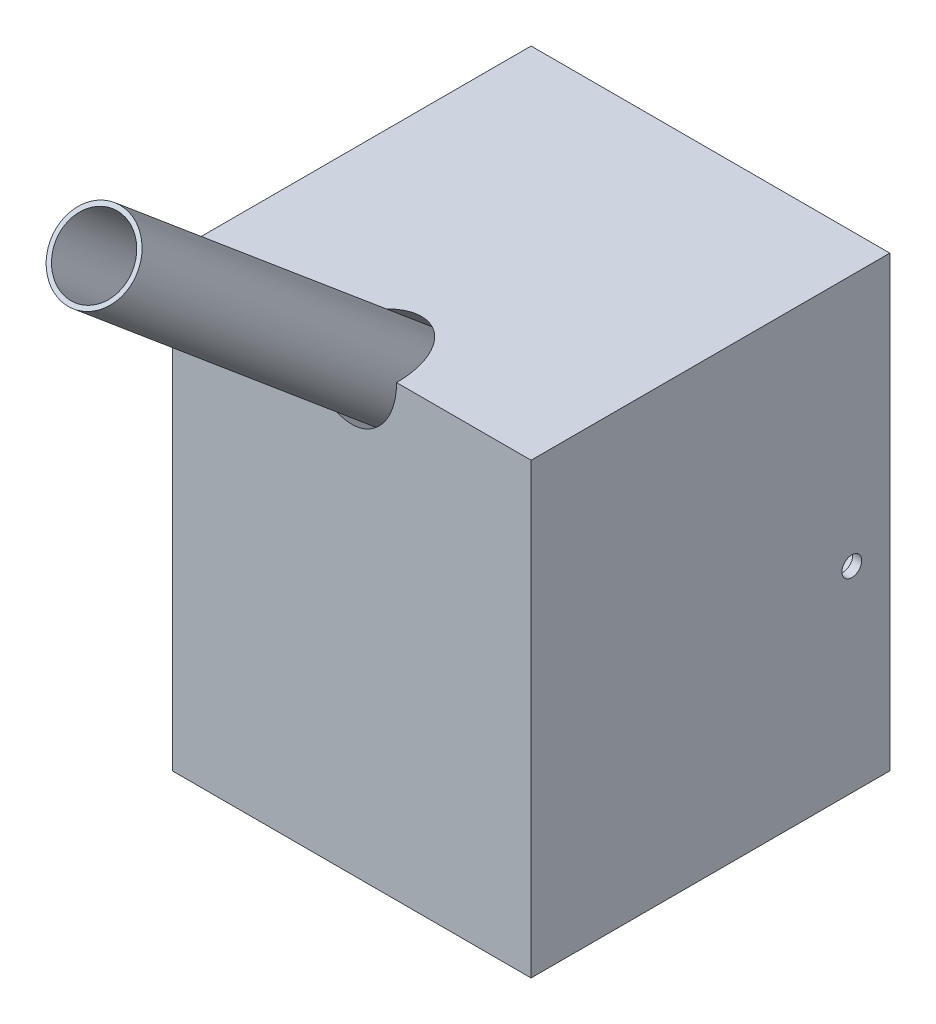
ISO-10303-21;
HEADER;
FILE_DESCRIPTION(('STEP AP214'),'2;1');
FILE_NAME('part.step','',(''),(''),'','','');
FILE_SCHEMA(('AUTOMOTIVE_DESIGN { 1 0 10303 214 1 1 1 1 }'));
ENDSEC;
DATA;
#1=APPLICATION_CONTEXT('core data for automotive mechanical design processes');
#2=APPLICATION_PROTOCOL_DEFINITION('international standard','automotive_design',2000,#1);
#3=PRODUCT_CONTEXT('',#1,'mechanical');
#4=PRODUCT('Part','Part','',(#3));
#5=PRODUCT_RELATED_PRODUCT_CATEGORY('part','',(#4));
#6=PRODUCT_DEFINITION_FORMATION('','',#4);
#7=PRODUCT_DEFINITION_CONTEXT('part definition',#1,'design');
#8=PRODUCT_DEFINITION('design','',#6,#7);
#9=PRODUCT_DEFINITION_SHAPE('','',#8);
#10=(LENGTH_UNIT() NAMED_UNIT(*) SI_UNIT(.MILLI.,.METRE.));
#11=(NAMED_UNIT(*) PLANE_ANGLE_UNIT() SI_UNIT($,.RADIAN.));
#12=(NAMED_UNIT(*) SI_UNIT($,.STERADIAN.) SOLID_ANGLE_UNIT());
#13=UNCERTAINTY_MEASURE_WITH_UNIT(LENGTH_MEASURE(1.E-05),#10,'distance_accuracy_value','');
#14=(GEOMETRIC_REPRESENTATION_CONTEXT(3) GLOBAL_UNCERTAINTY_ASSIGNED_CONTEXT((#13)) GLOBAL_UNIT_ASSIGNED_CONTEXT((#10,
#11,#12)) REPRESENTATION_CONTEXT('',''));
#15=CARTESIAN_POINT('',(0.,0.,0.));
#16=DIRECTION('',(0.,0.,1.));
#17=DIRECTION('',(1.,0.,0.));
#18=AXIS2_PLACEMENT_3D('',#15,#16,#17);
#19=CARTESIAN_POINT('',(6076.77419354839,-5727.33034181486,18.7733333830374));
#20=DIRECTION('',(0.,0.642787609686541,0.766044443118977));
#21=DIRECTION('',(0.,-0.766044443118977,0.642787609686541));
#22=AXIS2_PLACEMENT_3D('',#19,#20,#21);
#23=CYLINDRICAL_SURFACE('',#22,4.50000000000008);
#24=CARTESIAN_POINT('',(6076.77419354839,-5727.33034181486,18.7733333830374));
#25=DIRECTION('',(0.,-0.64278760968654,-0.766044443118977));
#26=DIRECTION('',(0.,0.766044443118977,-0.642787609686541));
#27=AXIS2_PLACEMENT_3D('',#24,#25,#26);
#28=CIRCLE('',#27,4.50000000000008);
#29=CARTESIAN_POINT('',(6076.77419354839,-5723.88314182083,15.8807891394479));
#30=VERTEX_POINT('',#29);
#31=EDGE_CURVE('E11',#30,#30,#28,.T.);
#32=ORIENTED_EDGE('',*,*,#31,.F.);
#33=EDGE_LOOP('',(#32));
#34=FACE_BOUND('',#33,.T.);
#35=CARTESIAN_POINT('',(6076.77419354839,-5679.12127108837,76.2266666169606));
#36=DIRECTION('',(0.,-0.64278760968654,-0.766044443118977));
#37=DIRECTION('',(0.,0.766044443118977,-0.642787609686541));
#38=AXIS2_PLACEMENT_3D('',#35,#36,#37);
#39=CIRCLE('',#38,4.50000000000008);
#40=CARTESIAN_POINT('',(6076.77419354839,-5675.67407109433,73.3341223733711));
#41=VERTEX_POINT('',#40);
#42=EDGE_CURVE('E48',#41,#41,#39,.T.);
#43=ORIENTED_EDGE('',*,*,#42,.T.);
#44=EDGE_LOOP('',(#43));
#45=FACE_BOUND('',#44,.T.);
#46=ADVANCED_FACE('F41',(#34,#45),#23,.T.);
#47=CARTESIAN_POINT('',(6076.77419354839,-5727.33034181486,18.7733333830374));
#48=DIRECTION('',(0.,-0.64278760968654,-0.766044443118977));
#49=DIRECTION('',(0.,0.766044443118977,-0.642787609686541));
#50=AXIS2_PLACEMENT_3D('',#47,#48,#49);
#51=PLANE('',#50);
#52=CARTESIAN_POINT('',(6076.77419354839,-5727.33034181486,18.7733333830371));
#53=DIRECTION('',(0.,-0.642787609686541,-0.766044443118977));
#54=DIRECTION('',(0.,0.766044443118977,-0.642787609686541));
#55=AXIS2_PLACEMENT_3D('',#52,#53,#54);
#56=CIRCLE('',#55,3.99999999999942);
#57=CARTESIAN_POINT('',(6076.77419354839,-5724.26616404239,16.2021829442913));
#58=VERTEX_POINT('',#57);
#59=EDGE_CURVE('E54',#58,#58,#56,.T.);
#60=ORIENTED_EDGE('',*,*,#59,.F.);
#61=EDGE_LOOP('',(#60));
#62=FACE_BOUND('',#61,.T.);
#63=ORIENTED_EDGE('',*,*,#31,.T.);
#64=EDGE_LOOP('',(#63));
#65=FACE_BOUND('',#64,.T.);
#66=ADVANCED_FACE('F70',(#62,#65),#51,.T.);
#67=CARTESIAN_POINT('',(6076.77419354839,-5679.12127108837,76.2266666169606));
#68=DIRECTION('',(0.,-0.64278760968654,-0.766044443118977));
#69=DIRECTION('',(0.,0.766044443118977,-0.642787609686541));
#70=AXIS2_PLACEMENT_3D('',#67,#68,#69);
#71=PLANE('',#70);
#72=CARTESIAN_POINT('',(6076.77419354839,-5679.12127108837,76.2266666169614));
#73=DIRECTION('',(0.,-0.64278760968654,-0.766044443118977));
#74=DIRECTION('',(0.,0.766044443118977,-0.642787609686541));
#75=AXIS2_PLACEMENT_3D('',#72,#73,#74);
#76=CIRCLE('',#75,3.99999999999942);
#77=CARTESIAN_POINT('',(6076.77419354839,-5676.0570933159,73.6555161782156));
#78=VERTEX_POINT('',#77);
#79=EDGE_CURVE('E44',#78,#78,#76,.T.);
#80=ORIENTED_EDGE('',*,*,#79,.T.);
#81=EDGE_LOOP('',(#80));
#82=FACE_BOUND('',#81,.T.);
#83=ORIENTED_EDGE('',*,*,#42,.F.);
#84=EDGE_LOOP('',(#83));
#85=FACE_BOUND('',#84,.T.);
#86=ADVANCED_FACE('F61',(#82,#85),#71,.F.);
#87=CARTESIAN_POINT('',(6076.77419354839,-5676.27267109135,79.621495897271));
#88=DIRECTION('',(0.,-0.642787609686541,-0.766044443118977));
#89=DIRECTION('',(0.,0.766044443118977,-0.642787609686541));
#90=AXIS2_PLACEMENT_3D('',#87,#88,#89);
#91=CYLINDRICAL_SURFACE('',#90,3.99999999999942);
#92=ORIENTED_EDGE('',*,*,#59,.T.);
#93=EDGE_LOOP('',(#92));
#94=FACE_BOUND('',#93,.T.);
#95=ORIENTED_EDGE('',*,*,#79,.F.);
#96=EDGE_LOOP('',(#95));
#97=FACE_BOUND('',#96,.T.);
#98=ADVANCED_FACE('F64',(#94,#97),#91,.F.);
#99=CLOSED_SHELL('',(#46,#66,#86,#98));
#100=MANIFOLD_SOLID_BREP('B2',#99);
#101=CARTESIAN_POINT('',(6056.77419354839,-5703.22580645161,47.5));
#102=DIRECTION('',(0.,-1.,0.));
#103=DIRECTION('',(0.,0.,-1.));
#104=AXIS2_PLACEMENT_3D('',#101,#102,#103);
#105=PLANE('',#104);
#106=CARTESIAN_POINT('',(6076.77419354839,-5703.22580645161,47.5000000000028));
#107=DIRECTION('',(0.,-1.,0.));
#108=DIRECTION('',(0.,0.,1.));
#109=AXIS2_PLACEMENT_3D('',#106,#107,#108);
#110=ELLIPSE('',#109,7.77861913430273,5.00000000000044);
#111=CARTESIAN_POINT('',(6081.77419354839,-5703.22580645162,47.5000000000003));
#112=VERTEX_POINT('',#111);
#113=CARTESIAN_POINT('',(6071.77419354839,-5703.22580645161,47.5));
#114=VERTEX_POINT('',#113);
#115=EDGE_CURVE('E119',#112,#114,#110,.F.);
#116=ORIENTED_EDGE('',*,*,#115,.F.);
#117=DIRECTION('',(-1.,0.,0.));
#118=VECTOR('',#117,1.);
#119=CARTESIAN_POINT('',(6056.77419354839,-5703.22580645161,47.5));
#120=LINE('',#119,#118);
#121=CARTESIAN_POINT('',(6096.77419354839,-5703.22580645161,47.5));
#122=VERTEX_POINT('',#121);
#123=EDGE_CURVE('E187',#122,#112,#120,.T.);
#124=ORIENTED_EDGE('',*,*,#123,.F.);
#125=DIRECTION('',(0.,0.,-1.));
#126=VECTOR('',#125,1.);
#127=CARTESIAN_POINT('',(6096.77419354839,-5703.22580645161,47.5));
#128=LINE('',#127,#126);
#129=CARTESIAN_POINT('',(6096.77419354839,-5703.22580645161,7.5));
#130=VERTEX_POINT('',#129);
#131=EDGE_CURVE('E199',#122,#130,#128,.T.);
#132=ORIENTED_EDGE('',*,*,#131,.T.);
#133=DIRECTION('',(-1.,0.,0.));
#134=VECTOR('',#133,1.);
#135=CARTESIAN_POINT('',(6056.77419354839,-5703.22580645161,7.5));
#136=LINE('',#135,#134);
#137=CARTESIAN_POINT('',(6056.77419354839,-5703.22580645161,7.5));
#138=VERTEX_POINT('',#137);
#139=EDGE_CURVE('E212',#130,#138,#136,.T.);
#140=ORIENTED_EDGE('',*,*,#139,.T.);
#141=DIRECTION('',(0.,0.,-1.));
#142=VECTOR('',#141,1.);
#143=CARTESIAN_POINT('',(6056.77419354839,-5703.22580645161,47.5));
#144=LINE('',#143,#142);
#145=CARTESIAN_POINT('',(6056.77419354839,-5703.22580645161,47.5));
#146=VERTEX_POINT('',#145);
#147=EDGE_CURVE('E196',#146,#138,#144,.T.);
#148=ORIENTED_EDGE('',*,*,#147,.F.);
#149=EDGE_CURVE('E189',#114,#146,#120,.T.);
#150=ORIENTED_EDGE('',*,*,#149,.F.);
#151=EDGE_LOOP('',(#116,#124,#132,#140,#148,#150));
#152=FACE_BOUND('',#151,.T.);
#153=ADVANCED_FACE('F103',(#152),#105,.F.);
#154=CARTESIAN_POINT('',(0.,0.,47.5));
#155=DIRECTION('',(0.,0.,1.));
#156=DIRECTION('',(1.,0.,0.));
#157=AXIS2_PLACEMENT_3D('',#154,#155,#156);
#158=PLANE('',#157);
#159=ORIENTED_EDGE('',*,*,#123,.T.);
#160=CARTESIAN_POINT('',(6076.77419354839,-5703.22580645161,47.5));
#161=DIRECTION('',(0.,0.,1.));
#162=DIRECTION('',(0.,1.,0.));
#163=AXIS2_PLACEMENT_3D('',#160,#161,#162);
#164=ELLIPSE('',#163,6.52703644666198,5.00000000000044);
#165=EDGE_CURVE('E178',#112,#114,#164,.F.);
#166=ORIENTED_EDGE('',*,*,#165,.T.);
#167=ORIENTED_EDGE('',*,*,#149,.T.);
#168=DIRECTION('',(0.,-1.,0.));
#169=VECTOR('',#168,1.);
#170=CARTESIAN_POINT('',(6056.77419354839,-5703.22580645161,47.5));
#171=LINE('',#170,#169);
#172=CARTESIAN_POINT('',(6056.77419354839,-5753.22580645161,47.5));
#173=VERTEX_POINT('',#172);
#174=EDGE_CURVE('E213',#146,#173,#171,.T.);
#175=ORIENTED_EDGE('',*,*,#174,.T.);
#176=DIRECTION('',(1.,0.,0.));
#177=VECTOR('',#176,1.);
#178=CARTESIAN_POINT('',(6056.77419354839,-5753.22580645161,47.5));
#179=LINE('',#178,#177);
#180=CARTESIAN_POINT('',(6096.77419354839,-5753.22580645161,47.5));
#181=VERTEX_POINT('',#180);
#182=EDGE_CURVE('E273',#173,#181,#179,.T.);
#183=ORIENTED_EDGE('',*,*,#182,.T.);
#184=DIRECTION('',(0.,1.,0.));
#185=VECTOR('',#184,1.);
#186=CARTESIAN_POINT('',(6096.77419354839,-5703.22580645161,47.5));
#187=LINE('',#186,#185);
#188=EDGE_CURVE('E194',#181,#122,#187,.T.);
#189=ORIENTED_EDGE('',*,*,#188,.T.);
#190=EDGE_LOOP('',(#159,#166,#167,#175,#183,#189));
#191=FACE_BOUND('',#190,.T.);
#192=ADVANCED_FACE('F192',(#191),#158,.T.);
#193=CARTESIAN_POINT('',(6056.77419354839,-5703.22580645161,47.5));
#194=DIRECTION('',(1.,0.,0.));
#195=DIRECTION('',(0.,0.,-1.));
#196=AXIS2_PLACEMENT_3D('',#193,#194,#195);
#197=PLANE('',#196);
#198=CARTESIAN_POINT('',(6056.77419354839,-5731.34196190166,11.7357624749395));
#199=DIRECTION('',(-1.,0.,0.));
#200=DIRECTION('',(0.,0.,1.));
#201=AXIS2_PLACEMENT_3D('',#198,#199,#200);
#202=CIRCLE('',#201,1.10000000000025);
#203=CARTESIAN_POINT('',(6056.77419354839,-5731.34196190166,12.8357624749398));
#204=VERTEX_POINT('',#203);
#205=EDGE_CURVE('E224',#204,#204,#202,.T.);
#206=ORIENTED_EDGE('',*,*,#205,.F.);
#207=EDGE_LOOP('',(#206));
#208=FACE_BOUND('',#207,.T.);
#209=DIRECTION('',(0.,-1.,0.));
#210=VECTOR('',#209,1.);
#211=CARTESIAN_POINT('',(6056.77419354839,-5703.22580645161,7.5));
#212=LINE('',#211,#210);
#213=CARTESIAN_POINT('',(6056.77419354839,-5753.22580645161,7.5));
#214=VERTEX_POINT('',#213);
#215=EDGE_CURVE('E204',#138,#214,#212,.T.);
#216=ORIENTED_EDGE('',*,*,#215,.T.);
#217=DIRECTION('',(0.,0.,-1.));
#218=VECTOR('',#217,1.);
#219=CARTESIAN_POINT('',(6056.77419354839,-5753.22580645161,47.5));
#220=LINE('',#219,#218);
#221=EDGE_CURVE('E112',#173,#214,#220,.T.);
#222=ORIENTED_EDGE('',*,*,#221,.F.);
#223=ORIENTED_EDGE('',*,*,#174,.F.);
#224=ORIENTED_EDGE('',*,*,#147,.T.);
#225=EDGE_LOOP('',(#216,#222,#223,#224));
#226=FACE_BOUND('',#225,.T.);
#227=ADVANCED_FACE('F105',(#208,#226),#197,.F.);
#228=CARTESIAN_POINT('',(6056.77419354839,-5753.22580645161,47.5));
#229=DIRECTION('',(0.,1.,0.));
#230=DIRECTION('',(0.,0.,1.));
#231=AXIS2_PLACEMENT_3D('',#228,#229,#230);
#232=PLANE('',#231);
#233=DIRECTION('',(1.,0.,0.));
#234=VECTOR('',#233,1.);
#235=CARTESIAN_POINT('',(6056.77419354839,-5753.22580645161,7.5));
#236=LINE('',#235,#234);
#237=CARTESIAN_POINT('',(6096.77419354839,-5753.22580645161,7.5));
#238=VERTEX_POINT('',#237);
#239=EDGE_CURVE('E207',#214,#238,#236,.T.);
#240=ORIENTED_EDGE('',*,*,#239,.T.);
#241=DIRECTION('',(0.,0.,-1.));
#242=VECTOR('',#241,1.);
#243=CARTESIAN_POINT('',(6096.77419354839,-5753.22580645161,47.5));
#244=LINE('',#243,#242);
#245=EDGE_CURVE('E216',#181,#238,#244,.T.);
#246=ORIENTED_EDGE('',*,*,#245,.F.);
#247=ORIENTED_EDGE('',*,*,#182,.F.);
#248=ORIENTED_EDGE('',*,*,#221,.T.);
#249=EDGE_LOOP('',(#240,#246,#247,#248));
#250=FACE_BOUND('',#249,.T.);
#251=ADVANCED_FACE('F278',(#250),#232,.F.);
#252=CARTESIAN_POINT('',(6096.77419354839,-5703.22580645161,47.5));
#253=DIRECTION('',(-1.,0.,0.));
#254=DIRECTION('',(0.,-1.,0.));
#255=AXIS2_PLACEMENT_3D('',#252,#253,#254);
#256=PLANE('',#255);
#257=CARTESIAN_POINT('',(6096.77419354839,-5731.34196190166,11.7357624749395));
#258=DIRECTION('',(-1.,0.,0.));
#259=DIRECTION('',(0.,-1.,0.));
#260=AXIS2_PLACEMENT_3D('',#257,#258,#259);
#261=CIRCLE('',#260,1.10000000000025);
#262=CARTESIAN_POINT('',(6096.77419354839,-5732.44196190166,11.7357624749395));
#263=VERTEX_POINT('',#262);
#264=EDGE_CURVE('E223',#263,#263,#261,.T.);
#265=ORIENTED_EDGE('',*,*,#264,.T.);
#266=EDGE_LOOP('',(#265));
#267=FACE_BOUND('',#266,.T.);
#268=DIRECTION('',(0.,1.,0.));
#269=VECTOR('',#268,1.);
#270=CARTESIAN_POINT('',(6096.77419354839,-5703.22580645161,7.5));
#271=LINE('',#270,#269);
#272=EDGE_CURVE('E210',#238,#130,#271,.T.);
#273=ORIENTED_EDGE('',*,*,#272,.T.);
#274=ORIENTED_EDGE('',*,*,#131,.F.);
#275=ORIENTED_EDGE('',*,*,#188,.F.);
#276=ORIENTED_EDGE('',*,*,#245,.T.);
#277=EDGE_LOOP('',(#273,#274,#275,#276));
#278=FACE_BOUND('',#277,.T.);
#279=ADVANCED_FACE('F281',(#267,#278),#256,.F.);
#280=CARTESIAN_POINT('',(0.,0.,7.5));
#281=DIRECTION('',(0.,0.,1.));
#282=DIRECTION('',(1.,0.,0.));
#283=AXIS2_PLACEMENT_3D('',#280,#281,#282);
#284=PLANE('',#283);
#285=DIRECTION('',(-1.,0.,0.));
#286=VECTOR('',#285,1.);
#287=CARTESIAN_POINT('',(6091.77419354839,-5748.22580645161,7.5));
#288=LINE('',#287,#286);
#289=CARTESIAN_POINT('',(6091.77419354839,-5748.22580645161,7.5));
#290=VERTEX_POINT('',#289);
#291=CARTESIAN_POINT('',(6061.77419354839,-5748.22580645161,7.5));
#292=VERTEX_POINT('',#291);
#293=EDGE_CURVE('E257',#290,#292,#288,.T.);
#294=ORIENTED_EDGE('',*,*,#293,.F.);
#295=DIRECTION('',(0.,-1.,0.));
#296=VECTOR('',#295,1.);
#297=CARTESIAN_POINT('',(6091.77419354839,-5708.22580645161,7.5));
#298=LINE('',#297,#296);
#299=CARTESIAN_POINT('',(6091.77419354839,-5708.22580645161,7.5));
#300=VERTEX_POINT('',#299);
#301=EDGE_CURVE('E190',#300,#290,#298,.T.);
#302=ORIENTED_EDGE('',*,*,#301,.F.);
#303=DIRECTION('',(1.,0.,0.));
#304=VECTOR('',#303,1.);
#305=CARTESIAN_POINT('',(6091.77419354839,-5708.22580645161,7.5));
#306=LINE('',#305,#304);
#307=CARTESIAN_POINT('',(6061.77419354839,-5708.22580645161,7.5));
#308=VERTEX_POINT('',#307);
#309=EDGE_CURVE('E245',#308,#300,#306,.T.);
#310=ORIENTED_EDGE('',*,*,#309,.F.);
#311=DIRECTION('',(0.,1.,0.));
#312=VECTOR('',#311,1.);
#313=CARTESIAN_POINT('',(6061.77419354839,-5708.22580645161,7.5));
#314=LINE('',#313,#312);
#315=EDGE_CURVE('E260',#292,#308,#314,.T.);
#316=ORIENTED_EDGE('',*,*,#315,.F.);
#317=EDGE_LOOP('',(#294,#302,#310,#316));
#318=FACE_BOUND('',#317,.T.);
#319=ORIENTED_EDGE('',*,*,#215,.F.);
#320=ORIENTED_EDGE('',*,*,#139,.F.);
#321=ORIENTED_EDGE('',*,*,#272,.F.);
#322=ORIENTED_EDGE('',*,*,#239,.F.);
#323=EDGE_LOOP('',(#319,#320,#321,#322));
#324=FACE_BOUND('',#323,.T.);
#325=ADVANCED_FACE('F285',(#318,#324),#284,.F.);
#326=CARTESIAN_POINT('',(6091.77419354839,-5708.22580645161,42.5));
#327=DIRECTION('',(1.,0.,0.));
#328=DIRECTION('',(0.,0.,-1.));
#329=AXIS2_PLACEMENT_3D('',#326,#327,#328);
#330=PLANE('',#329);
#331=CARTESIAN_POINT('',(6091.77419354839,-5731.34196190166,11.7357624749395));
#332=DIRECTION('',(1.,0.,0.));
#333=DIRECTION('',(0.,0.,-1.));
#334=AXIS2_PLACEMENT_3D('',#331,#332,#333);
#335=CIRCLE('',#334,3.05000000000034);
#336=CARTESIAN_POINT('',(6091.77419354839,-5731.34196190166,8.68576247493917));
#337=VERTEX_POINT('',#336);
#338=EDGE_CURVE('E107',#337,#337,#335,.T.);
#339=ORIENTED_EDGE('',*,*,#338,.T.);
#340=EDGE_LOOP('',(#339));
#341=FACE_BOUND('',#340,.T.);
#342=ORIENTED_EDGE('',*,*,#301,.T.);
#343=DIRECTION('',(0.,0.,-1.));
#344=VECTOR('',#343,1.);
#345=CARTESIAN_POINT('',(6091.77419354839,-5748.22580645161,42.5));
#346=LINE('',#345,#344);
#347=CARTESIAN_POINT('',(6091.77419354839,-5748.22580645161,42.5));
#348=VERTEX_POINT('',#347);
#349=EDGE_CURVE('E255',#348,#290,#346,.T.);
#350=ORIENTED_EDGE('',*,*,#349,.F.);
#351=DIRECTION('',(0.,-1.,0.));
#352=VECTOR('',#351,1.);
#353=CARTESIAN_POINT('',(6091.77419354839,-5708.22580645161,42.5));
#354=LINE('',#353,#352);
#355=CARTESIAN_POINT('',(6091.77419354839,-5708.22580645161,42.5));
#356=VERTEX_POINT('',#355);
#357=EDGE_CURVE('E241',#356,#348,#354,.T.);
#358=ORIENTED_EDGE('',*,*,#357,.F.);
#359=DIRECTION('',(0.,0.,-1.));
#360=VECTOR('',#359,1.);
#361=CARTESIAN_POINT('',(6091.77419354839,-5708.22580645161,42.5));
#362=LINE('',#361,#360);
#363=EDGE_CURVE('E208',#356,#300,#362,.T.);
#364=ORIENTED_EDGE('',*,*,#363,.T.);
#365=EDGE_LOOP('',(#342,#350,#358,#364));
#366=FACE_BOUND('',#365,.T.);
#367=ADVANCED_FACE('F306',(#341,#366),#330,.F.);
#368=CARTESIAN_POINT('',(6091.77419354839,-5708.22580645161,42.5));
#369=DIRECTION('',(0.,1.,0.));
#370=DIRECTION('',(0.,0.,1.));
#371=AXIS2_PLACEMENT_3D('',#368,#369,#370);
#372=PLANE('',#371);
#373=CARTESIAN_POINT('',(6076.77419354839,-5708.22580645161,41.5412320370319));
#374=DIRECTION('',(0.,1.,0.));
#375=DIRECTION('',(0.,0.,1.));
#376=AXIS2_PLACEMENT_3D('',#373,#374,#375);
#377=ELLIPSE('',#376,7.77861913430273,5.00000000000044);
#378=CARTESIAN_POINT('',(6071.81231952486,-5708.22580645161,42.5));
#379=VERTEX_POINT('',#378);
#380=CARTESIAN_POINT('',(6081.73606757191,-5708.22580645161,42.5));
#381=VERTEX_POINT('',#380);
#382=EDGE_CURVE('E126',#379,#381,#377,.F.);
#383=ORIENTED_EDGE('',*,*,#382,.F.);
#384=DIRECTION('',(1.,0.,0.));
#385=VECTOR('',#384,1.);
#386=CARTESIAN_POINT('',(6091.77419354839,-5708.22580645161,42.5));
#387=LINE('',#386,#385);
#388=CARTESIAN_POINT('',(6061.77419354839,-5708.22580645161,42.5));
#389=VERTEX_POINT('',#388);
#390=EDGE_CURVE('E252',#389,#379,#387,.T.);
#391=ORIENTED_EDGE('',*,*,#390,.F.);
#392=DIRECTION('',(0.,0.,-1.));
#393=VECTOR('',#392,1.);
#394=CARTESIAN_POINT('',(6061.77419354839,-5708.22580645161,42.5));
#395=LINE('',#394,#393);
#396=EDGE_CURVE('E266',#389,#308,#395,.T.);
#397=ORIENTED_EDGE('',*,*,#396,.T.);
#398=ORIENTED_EDGE('',*,*,#309,.T.);
#399=ORIENTED_EDGE('',*,*,#363,.F.);
#400=EDGE_CURVE('E251',#381,#356,#387,.T.);
#401=ORIENTED_EDGE('',*,*,#400,.F.);
#402=EDGE_LOOP('',(#383,#391,#397,#398,#399,#401));
#403=FACE_BOUND('',#402,.T.);
#404=ADVANCED_FACE('F331',(#403),#372,.F.);
#405=CARTESIAN_POINT('',(6061.77419354839,-5708.22580645161,42.5));
#406=DIRECTION('',(-1.,0.,0.));
#407=DIRECTION('',(0.,0.,1.));
#408=AXIS2_PLACEMENT_3D('',#405,#406,#407);
#409=PLANE('',#408);
#410=CARTESIAN_POINT('',(6061.77419354839,-5731.34196190166,11.7357624749395));
#411=DIRECTION('',(-1.,0.,0.));
#412=DIRECTION('',(0.,0.,1.));
#413=AXIS2_PLACEMENT_3D('',#410,#411,#412);
#414=CIRCLE('',#413,1.10000000000025);
#415=CARTESIAN_POINT('',(6061.77419354839,-5731.34196190166,12.8357624749398));
#416=VERTEX_POINT('',#415);
#417=EDGE_CURVE('E221',#416,#416,#414,.T.);
#418=ORIENTED_EDGE('',*,*,#417,.T.);
#419=EDGE_LOOP('',(#418));
#420=FACE_BOUND('',#419,.T.);
#421=ORIENTED_EDGE('',*,*,#315,.T.);
#422=ORIENTED_EDGE('',*,*,#396,.F.);
#423=DIRECTION('',(0.,1.,0.));
#424=VECTOR('',#423,1.);
#425=CARTESIAN_POINT('',(6061.77419354839,-5708.22580645161,42.5));
#426=LINE('',#425,#424);
#427=CARTESIAN_POINT('',(6061.77419354839,-5748.22580645161,42.5));
#428=VERTEX_POINT('',#427);
#429=EDGE_CURVE('E248',#428,#389,#426,.T.);
#430=ORIENTED_EDGE('',*,*,#429,.F.);
#431=DIRECTION('',(0.,0.,-1.));
#432=VECTOR('',#431,1.);
#433=CARTESIAN_POINT('',(6061.77419354839,-5748.22580645161,42.5));
#434=LINE('',#433,#432);
#435=EDGE_CURVE('E268',#428,#292,#434,.T.);
#436=ORIENTED_EDGE('',*,*,#435,.T.);
#437=EDGE_LOOP('',(#421,#422,#430,#436));
#438=FACE_BOUND('',#437,.T.);
#439=ADVANCED_FACE('F334',(#420,#438),#409,.F.);
#440=CARTESIAN_POINT('',(6091.77419354839,-5748.22580645161,42.5));
#441=DIRECTION('',(0.,-1.,0.));
#442=DIRECTION('',(0.,0.,-1.));
#443=AXIS2_PLACEMENT_3D('',#440,#441,#442);
#444=PLANE('',#443);
#445=ORIENTED_EDGE('',*,*,#293,.T.);
#446=ORIENTED_EDGE('',*,*,#435,.F.);
#447=DIRECTION('',(-1.,0.,0.));
#448=VECTOR('',#447,1.);
#449=CARTESIAN_POINT('',(6091.77419354839,-5748.22580645161,42.5));
#450=LINE('',#449,#448);
#451=EDGE_CURVE('E244',#348,#428,#450,.T.);
#452=ORIENTED_EDGE('',*,*,#451,.F.);
#453=ORIENTED_EDGE('',*,*,#349,.T.);
#454=EDGE_LOOP('',(#445,#446,#452,#453));
#455=FACE_BOUND('',#454,.T.);
#456=ADVANCED_FACE('F329',(#455),#444,.F.);
#457=CARTESIAN_POINT('',(0.,0.,42.5));
#458=DIRECTION('',(0.,0.,-1.));
#459=DIRECTION('',(-1.,0.,0.));
#460=AXIS2_PLACEMENT_3D('',#457,#458,#459);
#461=PLANE('',#460);
#462=ORIENTED_EDGE('',*,*,#390,.T.);
#463=CARTESIAN_POINT('',(6076.77419354839,-5707.4213046075,42.5));
#464=DIRECTION('',(0.,0.,-1.));
#465=DIRECTION('',(0.,1.,0.));
#466=AXIS2_PLACEMENT_3D('',#463,#464,#465);
#467=ELLIPSE('',#466,6.52703644666198,5.00000000000044);
#468=EDGE_CURVE('E39',#379,#381,#467,.F.);
#469=ORIENTED_EDGE('',*,*,#468,.T.);
#470=ORIENTED_EDGE('',*,*,#400,.T.);
#471=ORIENTED_EDGE('',*,*,#357,.T.);
#472=ORIENTED_EDGE('',*,*,#451,.T.);
#473=ORIENTED_EDGE('',*,*,#429,.T.);
#474=EDGE_LOOP('',(#462,#469,#470,#471,#472,#473));
#475=FACE_BOUND('',#474,.T.);
#476=ADVANCED_FACE('F326',(#475),#461,.T.);
#477=CARTESIAN_POINT('',(6076.77419354839,-5718.00992147441,29.8809778082625));
#478=DIRECTION('',(0.,0.64278760968654,0.766044443118977));
#479=DIRECTION('',(0.,-0.766044443118977,0.642787609686541));
#480=AXIS2_PLACEMENT_3D('',#477,#478,#479);
#481=CYLINDRICAL_SURFACE('',#480,5.00000000000044);
#482=ORIENTED_EDGE('',*,*,#382,.T.);
#483=ORIENTED_EDGE('',*,*,#468,.F.);
#484=EDGE_LOOP('',(#482,#483));
#485=FACE_BOUND('',#484,.T.);
#486=ORIENTED_EDGE('',*,*,#115,.T.);
#487=ORIENTED_EDGE('',*,*,#165,.F.);
#488=EDGE_LOOP('',(#486,#487));
#489=FACE_BOUND('',#488,.T.);
#490=ADVANCED_FACE('F179',(#485,#489),#481,.F.);
#491=CARTESIAN_POINT('',(6144.77419354839,-5731.34196190166,11.7357624749395));
#492=DIRECTION('',(-1.,0.,0.));
#493=DIRECTION('',(0.,0.,1.));
#494=AXIS2_PLACEMENT_3D('',#491,#492,#493);
#495=CYLINDRICAL_SURFACE('',#494,1.10000000000025);
#496=ORIENTED_EDGE('',*,*,#205,.T.);
#497=EDGE_LOOP('',(#496));
#498=FACE_BOUND('',#497,.T.);
#499=ORIENTED_EDGE('',*,*,#417,.F.);
#500=EDGE_LOOP('',(#499));
#501=FACE_BOUND('',#500,.T.);
#502=ADVANCED_FACE('F313',(#498,#501),#495,.F.);
#503=CARTESIAN_POINT('',(6095.77419354838,-5731.34196190166,11.7357624749395));
#504=DIRECTION('',(1.,0.,0.));
#505=DIRECTION('',(0.,1.,0.));
#506=AXIS2_PLACEMENT_3D('',#503,#504,#505);
#507=CIRCLE('',#506,1.10000000000025);
#508=CARTESIAN_POINT('',(6095.77419354838,-5730.24196190166,11.7357624749395));
#509=VERTEX_POINT('',#508);
#510=EDGE_CURVE('E225',#509,#509,#507,.F.);
#511=ORIENTED_EDGE('',*,*,#510,.T.);
#512=EDGE_LOOP('',(#511));
#513=FACE_BOUND('',#512,.T.);
#514=ORIENTED_EDGE('',*,*,#264,.F.);
#515=EDGE_LOOP('',(#514));
#516=FACE_BOUND('',#515,.T.);
#517=ADVANCED_FACE('F310',(#513,#516),#495,.F.);
#518=CARTESIAN_POINT('',(6082.77419354838,-5731.34196190166,11.7357624749395));
#519=DIRECTION('',(1.,0.,0.));
#520=DIRECTION('',(0.,1.,0.));
#521=AXIS2_PLACEMENT_3D('',#518,#519,#520);
#522=CYLINDRICAL_SURFACE('',#521,3.05000000000034);
#523=CARTESIAN_POINT('',(6095.77419354838,-5731.34196190166,11.7357624749395));
#524=DIRECTION('',(1.,0.,0.));
#525=DIRECTION('',(0.,1.,0.));
#526=AXIS2_PLACEMENT_3D('',#523,#524,#525);
#527=CIRCLE('',#526,3.05000000000034);
#528=CARTESIAN_POINT('',(6095.77419354838,-5728.29196190166,11.7357624749395));
#529=VERTEX_POINT('',#528);
#530=EDGE_CURVE('E227',#529,#529,#527,.T.);
#531=ORIENTED_EDGE('',*,*,#530,.T.);
#532=EDGE_LOOP('',(#531));
#533=FACE_BOUND('',#532,.T.);
#534=ORIENTED_EDGE('',*,*,#338,.F.);
#535=EDGE_LOOP('',(#534));
#536=FACE_BOUND('',#535,.T.);
#537=ADVANCED_FACE('F312',(#533,#536),#522,.F.);
#538=CARTESIAN_POINT('',(6095.77419354838,-5731.34196190166,11.7357624749395));
#539=DIRECTION('',(1.,0.,0.));
#540=DIRECTION('',(0.,1.,0.));
#541=AXIS2_PLACEMENT_3D('',#538,#539,#540);
#542=PLANE('',#541);
#543=ORIENTED_EDGE('',*,*,#530,.F.);
#544=EDGE_LOOP('',(#543));
#545=FACE_BOUND('',#544,.T.);
#546=ORIENTED_EDGE('',*,*,#510,.F.);
#547=EDGE_LOOP('',(#546));
#548=FACE_BOUND('',#547,.T.);
#549=ADVANCED_FACE('F319',(#545,#548),#542,.F.);
#550=CLOSED_SHELL('',(#153,#192,#227,#251,#279,#325,#367,#404,#439,#456,#476,#490,#502,#517,
#537,#549));
#551=MANIFOLD_SOLID_BREP('B6',#550);
#552=ADVANCED_BREP_SHAPE_REPRESENTATION('',(#18,#100,#551),#14);
#553=SHAPE_DEFINITION_REPRESENTATION(#9,#552);
ENDSEC;
END-ISO-10303-21;
